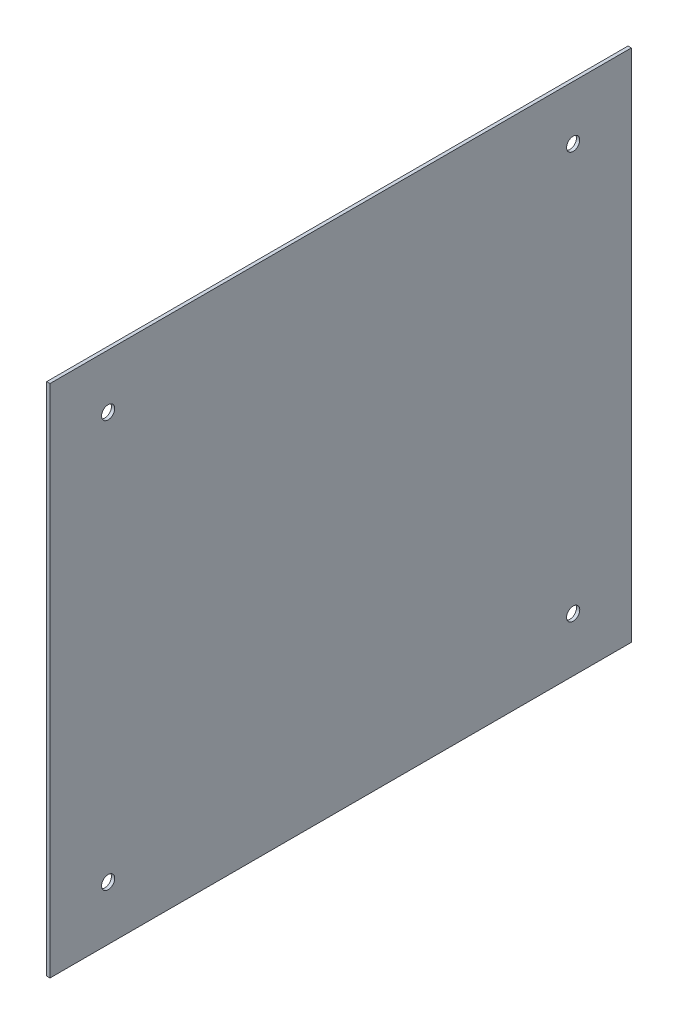
ISO-10303-21;
HEADER;
FILE_DESCRIPTION(('STEP AP214'),'2;1');
FILE_NAME('part.step','',(''),(''),'','','');
FILE_SCHEMA(('AUTOMOTIVE_DESIGN { 1 0 10303 214 1 1 1 1 }'));
ENDSEC;
DATA;
#1=APPLICATION_CONTEXT('core data for automotive mechanical design processes');
#2=APPLICATION_PROTOCOL_DEFINITION('international standard','automotive_design',2000,#1);
#3=PRODUCT_CONTEXT('',#1,'mechanical');
#4=PRODUCT('Part','Part','',(#3));
#5=PRODUCT_RELATED_PRODUCT_CATEGORY('part','',(#4));
#6=PRODUCT_DEFINITION_FORMATION('','',#4);
#7=PRODUCT_DEFINITION_CONTEXT('part definition',#1,'design');
#8=PRODUCT_DEFINITION('design','',#6,#7);
#9=PRODUCT_DEFINITION_SHAPE('','',#8);
#10=(LENGTH_UNIT() NAMED_UNIT(*) SI_UNIT(.MILLI.,.METRE.));
#11=(NAMED_UNIT(*) PLANE_ANGLE_UNIT() SI_UNIT($,.RADIAN.));
#12=(NAMED_UNIT(*) SI_UNIT($,.STERADIAN.) SOLID_ANGLE_UNIT());
#13=UNCERTAINTY_MEASURE_WITH_UNIT(LENGTH_MEASURE(1.E-05),#10,'distance_accuracy_value','');
#14=(GEOMETRIC_REPRESENTATION_CONTEXT(3) GLOBAL_UNCERTAINTY_ASSIGNED_CONTEXT((#13)) GLOBAL_UNIT_ASSIGNED_CONTEXT((#10,
#11,#12)) REPRESENTATION_CONTEXT('',''));
#15=CARTESIAN_POINT('',(0.,0.,0.));
#16=DIRECTION('',(0.,0.,1.));
#17=DIRECTION('',(1.,0.,0.));
#18=AXIS2_PLACEMENT_3D('',#15,#16,#17);
#19=CARTESIAN_POINT('',(2.,-155.,175.));
#20=DIRECTION('',(0.,0.,-1.));
#21=DIRECTION('',(-1.,0.,0.));
#22=AXIS2_PLACEMENT_3D('',#19,#20,#21);
#23=PLANE('',#22);
#24=DIRECTION('',(0.,-1.,0.));
#25=VECTOR('',#24,1.);
#26=CARTESIAN_POINT('',(0.,-155.,175.));
#27=LINE('',#26,#25);
#28=CARTESIAN_POINT('',(0.,155.,175.));
#29=VERTEX_POINT('',#28);
#30=CARTESIAN_POINT('',(0.,-155.,175.));
#31=VERTEX_POINT('',#30);
#32=EDGE_CURVE('E96',#29,#31,#27,.T.);
#33=ORIENTED_EDGE('',*,*,#32,.T.);
#34=DIRECTION('',(-1.,0.,0.));
#35=VECTOR('',#34,1.);
#36=CARTESIAN_POINT('',(2.,-155.,175.));
#37=LINE('',#36,#35);
#38=CARTESIAN_POINT('',(2.,-155.,175.));
#39=VERTEX_POINT('',#38);
#40=EDGE_CURVE('E11',#39,#31,#37,.T.);
#41=ORIENTED_EDGE('',*,*,#40,.F.);
#42=DIRECTION('',(0.,-1.,0.));
#43=VECTOR('',#42,1.);
#44=CARTESIAN_POINT('',(2.,-155.,175.));
#45=LINE('',#44,#43);
#46=CARTESIAN_POINT('',(2.,155.,175.));
#47=VERTEX_POINT('',#46);
#48=EDGE_CURVE('E84',#47,#39,#45,.T.);
#49=ORIENTED_EDGE('',*,*,#48,.F.);
#50=DIRECTION('',(-1.,0.,0.));
#51=VECTOR('',#50,1.);
#52=CARTESIAN_POINT('',(2.,155.,175.));
#53=LINE('',#52,#51);
#54=EDGE_CURVE('E92',#47,#29,#53,.T.);
#55=ORIENTED_EDGE('',*,*,#54,.T.);
#56=EDGE_LOOP('',(#33,#41,#49,#55));
#57=FACE_BOUND('',#56,.T.);
#58=ADVANCED_FACE('F33',(#57),#23,.F.);
#59=CARTESIAN_POINT('',(2.,-155.,-175.));
#60=DIRECTION('',(0.,1.,0.));
#61=DIRECTION('',(0.,0.,1.));
#62=AXIS2_PLACEMENT_3D('',#59,#60,#61);
#63=PLANE('',#62);
#64=DIRECTION('',(0.,0.,-1.));
#65=VECTOR('',#64,1.);
#66=CARTESIAN_POINT('',(0.,-155.,-175.));
#67=LINE('',#66,#65);
#68=CARTESIAN_POINT('',(0.,-155.,-175.));
#69=VERTEX_POINT('',#68);
#70=EDGE_CURVE('E88',#31,#69,#67,.T.);
#71=ORIENTED_EDGE('',*,*,#70,.T.);
#72=DIRECTION('',(-1.,0.,0.));
#73=VECTOR('',#72,1.);
#74=CARTESIAN_POINT('',(2.,-155.,-175.));
#75=LINE('',#74,#73);
#76=CARTESIAN_POINT('',(2.,-155.,-175.));
#77=VERTEX_POINT('',#76);
#78=EDGE_CURVE('E41',#77,#69,#75,.T.);
#79=ORIENTED_EDGE('',*,*,#78,.F.);
#80=DIRECTION('',(0.,0.,-1.));
#81=VECTOR('',#80,1.);
#82=CARTESIAN_POINT('',(2.,-155.,-175.));
#83=LINE('',#82,#81);
#84=EDGE_CURVE('E79',#39,#77,#83,.T.);
#85=ORIENTED_EDGE('',*,*,#84,.F.);
#86=ORIENTED_EDGE('',*,*,#40,.T.);
#87=EDGE_LOOP('',(#71,#79,#85,#86));
#88=FACE_BOUND('',#87,.T.);
#89=ADVANCED_FACE('F87',(#88),#63,.F.);
#90=CARTESIAN_POINT('',(2.,-155.,-175.));
#91=DIRECTION('',(0.,0.,1.));
#92=DIRECTION('',(1.,0.,0.));
#93=AXIS2_PLACEMENT_3D('',#90,#91,#92);
#94=PLANE('',#93);
#95=DIRECTION('',(0.,1.,0.));
#96=VECTOR('',#95,1.);
#97=CARTESIAN_POINT('',(0.,-155.,-175.));
#98=LINE('',#97,#96);
#99=CARTESIAN_POINT('',(0.,155.,-175.));
#100=VERTEX_POINT('',#99);
#101=EDGE_CURVE('E66',#69,#100,#98,.T.);
#102=ORIENTED_EDGE('',*,*,#101,.T.);
#103=DIRECTION('',(-1.,0.,0.));
#104=VECTOR('',#103,1.);
#105=CARTESIAN_POINT('',(2.,155.,-175.));
#106=LINE('',#105,#104);
#107=CARTESIAN_POINT('',(2.,155.,-175.));
#108=VERTEX_POINT('',#107);
#109=EDGE_CURVE('E89',#108,#100,#106,.T.);
#110=ORIENTED_EDGE('',*,*,#109,.F.);
#111=DIRECTION('',(0.,1.,0.));
#112=VECTOR('',#111,1.);
#113=CARTESIAN_POINT('',(2.,-155.,-175.));
#114=LINE('',#113,#112);
#115=EDGE_CURVE('E82',#77,#108,#114,.T.);
#116=ORIENTED_EDGE('',*,*,#115,.F.);
#117=ORIENTED_EDGE('',*,*,#78,.T.);
#118=EDGE_LOOP('',(#102,#110,#116,#117));
#119=FACE_BOUND('',#118,.T.);
#120=ADVANCED_FACE('F90',(#119),#94,.F.);
#121=CARTESIAN_POINT('',(2.,155.,-175.));
#122=DIRECTION('',(0.,-1.,0.));
#123=DIRECTION('',(0.,0.,-1.));
#124=AXIS2_PLACEMENT_3D('',#121,#122,#123);
#125=PLANE('',#124);
#126=DIRECTION('',(0.,0.,1.));
#127=VECTOR('',#126,1.);
#128=CARTESIAN_POINT('',(0.,155.,-175.));
#129=LINE('',#128,#127);
#130=EDGE_CURVE('E72',#100,#29,#129,.T.);
#131=ORIENTED_EDGE('',*,*,#130,.T.);
#132=ORIENTED_EDGE('',*,*,#54,.F.);
#133=DIRECTION('',(0.,0.,1.));
#134=VECTOR('',#133,1.);
#135=CARTESIAN_POINT('',(2.,155.,-175.));
#136=LINE('',#135,#134);
#137=EDGE_CURVE('E49',#108,#47,#136,.T.);
#138=ORIENTED_EDGE('',*,*,#137,.F.);
#139=ORIENTED_EDGE('',*,*,#109,.T.);
#140=EDGE_LOOP('',(#131,#132,#138,#139));
#141=FACE_BOUND('',#140,.T.);
#142=ADVANCED_FACE('F104',(#141),#125,.F.);
#143=CARTESIAN_POINT('',(2.,0.,0.));
#144=DIRECTION('',(1.,0.,0.));
#145=DIRECTION('',(0.,0.,-1.));
#146=AXIS2_PLACEMENT_3D('',#143,#144,#145);
#147=PLANE('',#146);
#148=CARTESIAN_POINT('',(2.,-122.5,140.));
#149=DIRECTION('',(1.,0.,0.));
#150=DIRECTION('',(0.,0.,1.));
#151=AXIS2_PLACEMENT_3D('',#148,#149,#150);
#152=CIRCLE('',#151,3.96999999999999);
#153=CARTESIAN_POINT('',(2.,-122.5,143.97));
#154=VERTEX_POINT('',#153);
#155=EDGE_CURVE('E128',#154,#154,#152,.T.);
#156=ORIENTED_EDGE('',*,*,#155,.F.);
#157=EDGE_LOOP('',(#156));
#158=FACE_BOUND('',#157,.T.);
#159=CARTESIAN_POINT('',(2.,-122.5,-140.));
#160=DIRECTION('',(1.,0.,0.));
#161=DIRECTION('',(0.,0.,-1.));
#162=AXIS2_PLACEMENT_3D('',#159,#160,#161);
#163=CIRCLE('',#162,3.96999999999999);
#164=CARTESIAN_POINT('',(2.,-122.5,-143.97));
#165=VERTEX_POINT('',#164);
#166=EDGE_CURVE('E122',#165,#165,#163,.T.);
#167=ORIENTED_EDGE('',*,*,#166,.F.);
#168=EDGE_LOOP('',(#167));
#169=FACE_BOUND('',#168,.T.);
#170=CARTESIAN_POINT('',(2.,122.5,-140.));
#171=DIRECTION('',(1.,0.,0.));
#172=DIRECTION('',(0.,0.,1.));
#173=AXIS2_PLACEMENT_3D('',#170,#171,#172);
#174=CIRCLE('',#173,3.96999999999999);
#175=CARTESIAN_POINT('',(2.,122.5,-136.03));
#176=VERTEX_POINT('',#175);
#177=EDGE_CURVE('E116',#176,#176,#174,.T.);
#178=ORIENTED_EDGE('',*,*,#177,.F.);
#179=EDGE_LOOP('',(#178));
#180=FACE_BOUND('',#179,.T.);
#181=CARTESIAN_POINT('',(2.,122.5,140.));
#182=DIRECTION('',(1.,0.,0.));
#183=DIRECTION('',(0.,0.,-1.));
#184=AXIS2_PLACEMENT_3D('',#181,#182,#183);
#185=CIRCLE('',#184,3.96999999999999);
#186=CARTESIAN_POINT('',(2.,122.5,136.03));
#187=VERTEX_POINT('',#186);
#188=EDGE_CURVE('E110',#187,#187,#185,.T.);
#189=ORIENTED_EDGE('',*,*,#188,.F.);
#190=EDGE_LOOP('',(#189));
#191=FACE_BOUND('',#190,.T.);
#192=ORIENTED_EDGE('',*,*,#48,.T.);
#193=ORIENTED_EDGE('',*,*,#84,.T.);
#194=ORIENTED_EDGE('',*,*,#115,.T.);
#195=ORIENTED_EDGE('',*,*,#137,.T.);
#196=EDGE_LOOP('',(#192,#193,#194,#195));
#197=FACE_BOUND('',#196,.T.);
#198=ADVANCED_FACE('F80',(#158,#169,#180,#191,#197),#147,.T.);
#199=CARTESIAN_POINT('',(0.,0.,0.));
#200=DIRECTION('',(1.,0.,0.));
#201=DIRECTION('',(0.,0.,-1.));
#202=AXIS2_PLACEMENT_3D('',#199,#200,#201);
#203=PLANE('',#202);
#204=CARTESIAN_POINT('',(0.,-122.5,140.));
#205=DIRECTION('',(1.,0.,0.));
#206=DIRECTION('',(0.,0.,1.));
#207=AXIS2_PLACEMENT_3D('',#204,#205,#206);
#208=CIRCLE('',#207,3.96999999999999);
#209=CARTESIAN_POINT('',(0.,-122.5,143.97));
#210=VERTEX_POINT('',#209);
#211=EDGE_CURVE('E113',#210,#210,#208,.T.);
#212=ORIENTED_EDGE('',*,*,#211,.T.);
#213=EDGE_LOOP('',(#212));
#214=FACE_BOUND('',#213,.T.);
#215=CARTESIAN_POINT('',(0.,-122.5,-140.));
#216=DIRECTION('',(1.,0.,0.));
#217=DIRECTION('',(0.,0.,-1.));
#218=AXIS2_PLACEMENT_3D('',#215,#216,#217);
#219=CIRCLE('',#218,3.96999999999999);
#220=CARTESIAN_POINT('',(0.,-122.5,-143.97));
#221=VERTEX_POINT('',#220);
#222=EDGE_CURVE('E125',#221,#221,#219,.T.);
#223=ORIENTED_EDGE('',*,*,#222,.T.);
#224=EDGE_LOOP('',(#223));
#225=FACE_BOUND('',#224,.T.);
#226=CARTESIAN_POINT('',(0.,122.5,-140.));
#227=DIRECTION('',(1.,0.,0.));
#228=DIRECTION('',(0.,0.,1.));
#229=AXIS2_PLACEMENT_3D('',#226,#227,#228);
#230=CIRCLE('',#229,3.96999999999999);
#231=CARTESIAN_POINT('',(0.,122.5,-136.03));
#232=VERTEX_POINT('',#231);
#233=EDGE_CURVE('E119',#232,#232,#230,.T.);
#234=ORIENTED_EDGE('',*,*,#233,.T.);
#235=EDGE_LOOP('',(#234));
#236=FACE_BOUND('',#235,.T.);
#237=CARTESIAN_POINT('',(0.,122.5,140.));
#238=DIRECTION('',(1.,0.,0.));
#239=DIRECTION('',(0.,0.,-1.));
#240=AXIS2_PLACEMENT_3D('',#237,#238,#239);
#241=CIRCLE('',#240,3.96999999999999);
#242=CARTESIAN_POINT('',(0.,122.5,136.03));
#243=VERTEX_POINT('',#242);
#244=EDGE_CURVE('E99',#243,#243,#241,.T.);
#245=ORIENTED_EDGE('',*,*,#244,.T.);
#246=EDGE_LOOP('',(#245));
#247=FACE_BOUND('',#246,.T.);
#248=ORIENTED_EDGE('',*,*,#32,.F.);
#249=ORIENTED_EDGE('',*,*,#130,.F.);
#250=ORIENTED_EDGE('',*,*,#101,.F.);
#251=ORIENTED_EDGE('',*,*,#70,.F.);
#252=EDGE_LOOP('',(#248,#249,#250,#251));
#253=FACE_BOUND('',#252,.T.);
#254=ADVANCED_FACE('F107',(#214,#225,#236,#247,#253),#203,.F.);
#255=CARTESIAN_POINT('',(0.,122.5,140.));
#256=DIRECTION('',(1.,0.,0.));
#257=DIRECTION('',(0.,0.,-1.));
#258=AXIS2_PLACEMENT_3D('',#255,#256,#257);
#259=CYLINDRICAL_SURFACE('',#258,3.96999999999999);
#260=ORIENTED_EDGE('',*,*,#244,.F.);
#261=EDGE_LOOP('',(#260));
#262=FACE_BOUND('',#261,.T.);
#263=ORIENTED_EDGE('',*,*,#188,.T.);
#264=EDGE_LOOP('',(#263));
#265=FACE_BOUND('',#264,.T.);
#266=ADVANCED_FACE('F152',(#262,#265),#259,.F.);
#267=CARTESIAN_POINT('',(0.,122.5,-140.));
#268=DIRECTION('',(1.,0.,0.));
#269=DIRECTION('',(0.,0.,-1.));
#270=AXIS2_PLACEMENT_3D('',#267,#268,#269);
#271=CYLINDRICAL_SURFACE('',#270,3.96999999999999);
#272=ORIENTED_EDGE('',*,*,#233,.F.);
#273=EDGE_LOOP('',(#272));
#274=FACE_BOUND('',#273,.T.);
#275=ORIENTED_EDGE('',*,*,#177,.T.);
#276=EDGE_LOOP('',(#275));
#277=FACE_BOUND('',#276,.T.);
#278=ADVANCED_FACE('F154',(#274,#277),#271,.F.);
#279=CARTESIAN_POINT('',(0.,-122.5,-140.));
#280=DIRECTION('',(1.,0.,0.));
#281=DIRECTION('',(0.,0.,-1.));
#282=AXIS2_PLACEMENT_3D('',#279,#280,#281);
#283=CYLINDRICAL_SURFACE('',#282,3.96999999999999);
#284=ORIENTED_EDGE('',*,*,#222,.F.);
#285=EDGE_LOOP('',(#284));
#286=FACE_BOUND('',#285,.T.);
#287=ORIENTED_EDGE('',*,*,#166,.T.);
#288=EDGE_LOOP('',(#287));
#289=FACE_BOUND('',#288,.T.);
#290=ADVANCED_FACE('F139',(#286,#289),#283,.F.);
#291=CARTESIAN_POINT('',(0.,-122.5,140.));
#292=DIRECTION('',(1.,0.,0.));
#293=DIRECTION('',(0.,0.,-1.));
#294=AXIS2_PLACEMENT_3D('',#291,#292,#293);
#295=CYLINDRICAL_SURFACE('',#294,3.96999999999999);
#296=ORIENTED_EDGE('',*,*,#211,.F.);
#297=EDGE_LOOP('',(#296));
#298=FACE_BOUND('',#297,.T.);
#299=ORIENTED_EDGE('',*,*,#155,.T.);
#300=EDGE_LOOP('',(#299));
#301=FACE_BOUND('',#300,.T.);
#302=ADVANCED_FACE('F136',(#298,#301),#295,.F.);
#303=CLOSED_SHELL('',(#58,#89,#120,#142,#198,#254,#266,#278,#290,#302));
#304=MANIFOLD_SOLID_BREP('B2',#303);
#305=ADVANCED_BREP_SHAPE_REPRESENTATION('',(#18,#304),#14);
#306=SHAPE_DEFINITION_REPRESENTATION(#9,#305);
ENDSEC;
END-ISO-10303-21;
